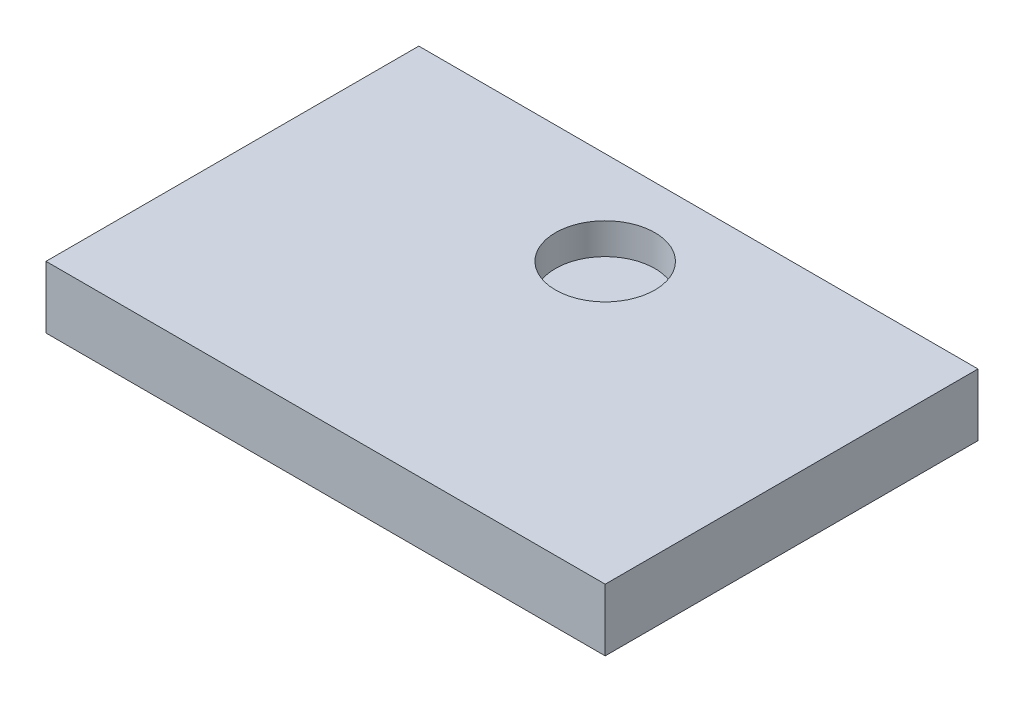
ISO-10303-21;
HEADER;
FILE_DESCRIPTION(('STEP AP214'),'2;1');
FILE_NAME('part.step','',(''),(''),'','','');
FILE_SCHEMA(('AUTOMOTIVE_DESIGN { 1 0 10303 214 1 1 1 1 }'));
ENDSEC;
DATA;
#1=APPLICATION_CONTEXT('core data for automotive mechanical design processes');
#2=APPLICATION_PROTOCOL_DEFINITION('international standard','automotive_design',2000,#1);
#3=PRODUCT_CONTEXT('',#1,'mechanical');
#4=PRODUCT('Part','Part','',(#3));
#5=PRODUCT_RELATED_PRODUCT_CATEGORY('part','',(#4));
#6=PRODUCT_DEFINITION_FORMATION('','',#4);
#7=PRODUCT_DEFINITION_CONTEXT('part definition',#1,'design');
#8=PRODUCT_DEFINITION('design','',#6,#7);
#9=PRODUCT_DEFINITION_SHAPE('','',#8);
#10=(LENGTH_UNIT() NAMED_UNIT(*) SI_UNIT(.MILLI.,.METRE.));
#11=(NAMED_UNIT(*) PLANE_ANGLE_UNIT() SI_UNIT($,.RADIAN.));
#12=(NAMED_UNIT(*) SI_UNIT($,.STERADIAN.) SOLID_ANGLE_UNIT());
#13=UNCERTAINTY_MEASURE_WITH_UNIT(LENGTH_MEASURE(1.E-05),#10,'distance_accuracy_value','');
#14=(GEOMETRIC_REPRESENTATION_CONTEXT(3) GLOBAL_UNCERTAINTY_ASSIGNED_CONTEXT((#13)) GLOBAL_UNIT_ASSIGNED_CONTEXT((#10,
#11,#12)) REPRESENTATION_CONTEXT('',''));
#15=CARTESIAN_POINT('',(0.,0.,0.));
#16=DIRECTION('',(0.,0.,1.));
#17=DIRECTION('',(1.,0.,0.));
#18=AXIS2_PLACEMENT_3D('',#15,#16,#17);
#19=CARTESIAN_POINT('',(0.,10.,0.));
#20=DIRECTION('',(1.,0.,0.));
#21=DIRECTION('',(0.,0.,-1.));
#22=AXIS2_PLACEMENT_3D('',#19,#20,#21);
#23=PLANE('',#22);
#24=DIRECTION('',(0.,0.,1.));
#25=VECTOR('',#24,1.);
#26=CARTESIAN_POINT('',(0.,0.,0.));
#27=LINE('',#26,#25);
#28=CARTESIAN_POINT('',(0.,0.,-60.));
#29=VERTEX_POINT('',#28);
#30=CARTESIAN_POINT('',(0.,0.,0.));
#31=VERTEX_POINT('',#30);
#32=EDGE_CURVE('E96',#29,#31,#27,.T.);
#33=ORIENTED_EDGE('',*,*,#32,.T.);
#34=DIRECTION('',(0.,-1.,0.));
#35=VECTOR('',#34,1.);
#36=CARTESIAN_POINT('',(0.,10.,0.));
#37=LINE('',#36,#35);
#38=CARTESIAN_POINT('',(0.,10.,0.));
#39=VERTEX_POINT('',#38);
#40=EDGE_CURVE('E11',#39,#31,#37,.T.);
#41=ORIENTED_EDGE('',*,*,#40,.F.);
#42=DIRECTION('',(0.,0.,1.));
#43=VECTOR('',#42,1.);
#44=CARTESIAN_POINT('',(0.,10.,0.));
#45=LINE('',#44,#43);
#46=CARTESIAN_POINT('',(0.,10.,-60.));
#47=VERTEX_POINT('',#46);
#48=EDGE_CURVE('E84',#47,#39,#45,.T.);
#49=ORIENTED_EDGE('',*,*,#48,.F.);
#50=DIRECTION('',(0.,-1.,0.));
#51=VECTOR('',#50,1.);
#52=CARTESIAN_POINT('',(0.,10.,-60.));
#53=LINE('',#52,#51);
#54=EDGE_CURVE('E92',#47,#29,#53,.T.);
#55=ORIENTED_EDGE('',*,*,#54,.T.);
#56=EDGE_LOOP('',(#33,#41,#49,#55));
#57=FACE_BOUND('',#56,.T.);
#58=ADVANCED_FACE('F33',(#57),#23,.F.);
#59=CARTESIAN_POINT('',(0.,10.,0.));
#60=DIRECTION('',(0.,0.,-1.));
#61=DIRECTION('',(-1.,0.,0.));
#62=AXIS2_PLACEMENT_3D('',#59,#60,#61);
#63=PLANE('',#62);
#64=DIRECTION('',(1.,0.,0.));
#65=VECTOR('',#64,1.);
#66=CARTESIAN_POINT('',(0.,0.,0.));
#67=LINE('',#66,#65);
#68=CARTESIAN_POINT('',(90.,0.,0.));
#69=VERTEX_POINT('',#68);
#70=EDGE_CURVE('E88',#31,#69,#67,.T.);
#71=ORIENTED_EDGE('',*,*,#70,.T.);
#72=DIRECTION('',(0.,-1.,0.));
#73=VECTOR('',#72,1.);
#74=CARTESIAN_POINT('',(90.,10.,0.));
#75=LINE('',#74,#73);
#76=CARTESIAN_POINT('',(90.,10.,0.));
#77=VERTEX_POINT('',#76);
#78=EDGE_CURVE('E41',#77,#69,#75,.T.);
#79=ORIENTED_EDGE('',*,*,#78,.F.);
#80=DIRECTION('',(1.,0.,0.));
#81=VECTOR('',#80,1.);
#82=CARTESIAN_POINT('',(0.,10.,0.));
#83=LINE('',#82,#81);
#84=EDGE_CURVE('E79',#39,#77,#83,.T.);
#85=ORIENTED_EDGE('',*,*,#84,.F.);
#86=ORIENTED_EDGE('',*,*,#40,.T.);
#87=EDGE_LOOP('',(#71,#79,#85,#86));
#88=FACE_BOUND('',#87,.T.);
#89=ADVANCED_FACE('F87',(#88),#63,.F.);
#90=CARTESIAN_POINT('',(90.,10.,0.));
#91=DIRECTION('',(-1.,0.,0.));
#92=DIRECTION('',(0.,0.,1.));
#93=AXIS2_PLACEMENT_3D('',#90,#91,#92);
#94=PLANE('',#93);
#95=DIRECTION('',(0.,0.,-1.));
#96=VECTOR('',#95,1.);
#97=CARTESIAN_POINT('',(90.,0.,0.));
#98=LINE('',#97,#96);
#99=CARTESIAN_POINT('',(90.,0.,-60.));
#100=VERTEX_POINT('',#99);
#101=EDGE_CURVE('E66',#69,#100,#98,.T.);
#102=ORIENTED_EDGE('',*,*,#101,.T.);
#103=DIRECTION('',(0.,-1.,0.));
#104=VECTOR('',#103,1.);
#105=CARTESIAN_POINT('',(90.,10.,-60.));
#106=LINE('',#105,#104);
#107=CARTESIAN_POINT('',(90.,10.,-60.));
#108=VERTEX_POINT('',#107);
#109=EDGE_CURVE('E89',#108,#100,#106,.T.);
#110=ORIENTED_EDGE('',*,*,#109,.F.);
#111=DIRECTION('',(0.,0.,-1.));
#112=VECTOR('',#111,1.);
#113=CARTESIAN_POINT('',(90.,10.,0.));
#114=LINE('',#113,#112);
#115=EDGE_CURVE('E82',#77,#108,#114,.T.);
#116=ORIENTED_EDGE('',*,*,#115,.F.);
#117=ORIENTED_EDGE('',*,*,#78,.T.);
#118=EDGE_LOOP('',(#102,#110,#116,#117));
#119=FACE_BOUND('',#118,.T.);
#120=ADVANCED_FACE('F90',(#119),#94,.F.);
#121=CARTESIAN_POINT('',(0.,10.,-60.));
#122=DIRECTION('',(0.,0.,1.));
#123=DIRECTION('',(1.,0.,0.));
#124=AXIS2_PLACEMENT_3D('',#121,#122,#123);
#125=PLANE('',#124);
#126=DIRECTION('',(-1.,0.,0.));
#127=VECTOR('',#126,1.);
#128=CARTESIAN_POINT('',(0.,0.,-60.));
#129=LINE('',#128,#127);
#130=EDGE_CURVE('E72',#100,#29,#129,.T.);
#131=ORIENTED_EDGE('',*,*,#130,.T.);
#132=ORIENTED_EDGE('',*,*,#54,.F.);
#133=DIRECTION('',(-1.,0.,0.));
#134=VECTOR('',#133,1.);
#135=CARTESIAN_POINT('',(0.,10.,-60.));
#136=LINE('',#135,#134);
#137=EDGE_CURVE('E49',#108,#47,#136,.T.);
#138=ORIENTED_EDGE('',*,*,#137,.F.);
#139=ORIENTED_EDGE('',*,*,#109,.T.);
#140=EDGE_LOOP('',(#131,#132,#138,#139));
#141=FACE_BOUND('',#140,.T.);
#142=ADVANCED_FACE('F104',(#141),#125,.F.);
#143=CARTESIAN_POINT('',(0.,10.,0.));
#144=DIRECTION('',(0.,-1.,0.));
#145=DIRECTION('',(0.,0.,-1.));
#146=AXIS2_PLACEMENT_3D('',#143,#144,#145);
#147=PLANE('',#146);
#148=CARTESIAN_POINT('',(45.,10.,-45.));
#149=DIRECTION('',(0.,1.,0.));
#150=DIRECTION('',(0.,0.,1.));
#151=AXIS2_PLACEMENT_3D('',#148,#149,#150);
#152=CIRCLE('',#151,8.);
#153=CARTESIAN_POINT('',(45.,10.,-37.));
#154=VERTEX_POINT('',#153);
#155=EDGE_CURVE('E110',#154,#154,#152,.T.);
#156=ORIENTED_EDGE('',*,*,#155,.F.);
#157=EDGE_LOOP('',(#156));
#158=FACE_BOUND('',#157,.T.);
#159=ORIENTED_EDGE('',*,*,#48,.T.);
#160=ORIENTED_EDGE('',*,*,#84,.T.);
#161=ORIENTED_EDGE('',*,*,#115,.T.);
#162=ORIENTED_EDGE('',*,*,#137,.T.);
#163=EDGE_LOOP('',(#159,#160,#161,#162));
#164=FACE_BOUND('',#163,.T.);
#165=ADVANCED_FACE('F80',(#158,#164),#147,.F.);
#166=CARTESIAN_POINT('',(0.,0.,0.));
#167=DIRECTION('',(0.,-1.,0.));
#168=DIRECTION('',(0.,0.,-1.));
#169=AXIS2_PLACEMENT_3D('',#166,#167,#168);
#170=PLANE('',#169);
#171=ORIENTED_EDGE('',*,*,#32,.F.);
#172=ORIENTED_EDGE('',*,*,#130,.F.);
#173=ORIENTED_EDGE('',*,*,#101,.F.);
#174=ORIENTED_EDGE('',*,*,#70,.F.);
#175=EDGE_LOOP('',(#171,#172,#173,#174));
#176=FACE_BOUND('',#175,.T.);
#177=ADVANCED_FACE('F107',(#176),#170,.T.);
#178=CARTESIAN_POINT('',(45.,5.,-45.));
#179=DIRECTION('',(0.,1.,0.));
#180=DIRECTION('',(0.,0.,1.));
#181=AXIS2_PLACEMENT_3D('',#178,#179,#180);
#182=CYLINDRICAL_SURFACE('',#181,8.);
#183=CARTESIAN_POINT('',(45.,5.,-45.));
#184=DIRECTION('',(0.,1.,0.));
#185=DIRECTION('',(0.,0.,1.));
#186=AXIS2_PLACEMENT_3D('',#183,#184,#185);
#187=CIRCLE('',#186,8.);
#188=CARTESIAN_POINT('',(45.,5.,-37.));
#189=VERTEX_POINT('',#188);
#190=EDGE_CURVE('E99',#189,#189,#187,.T.);
#191=ORIENTED_EDGE('',*,*,#190,.F.);
#192=EDGE_LOOP('',(#191));
#193=FACE_BOUND('',#192,.T.);
#194=ORIENTED_EDGE('',*,*,#155,.T.);
#195=EDGE_LOOP('',(#194));
#196=FACE_BOUND('',#195,.T.);
#197=ADVANCED_FACE('F118',(#193,#196),#182,.F.);
#198=CARTESIAN_POINT('',(45.,5.,-45.));
#199=DIRECTION('',(0.,1.,0.));
#200=DIRECTION('',(0.,0.,1.));
#201=AXIS2_PLACEMENT_3D('',#198,#199,#200);
#202=PLANE('',#201);
#203=ORIENTED_EDGE('',*,*,#190,.T.);
#204=EDGE_LOOP('',(#203));
#205=FACE_BOUND('',#204,.T.);
#206=ADVANCED_FACE('F116',(#205),#202,.T.);
#207=CLOSED_SHELL('',(#58,#89,#120,#142,#165,#177,#197,#206));
#208=MANIFOLD_SOLID_BREP('B2',#207);
#209=ADVANCED_BREP_SHAPE_REPRESENTATION('',(#18,#208),#14);
#210=SHAPE_DEFINITION_REPRESENTATION(#9,#209);
ENDSEC;
END-ISO-10303-21;
